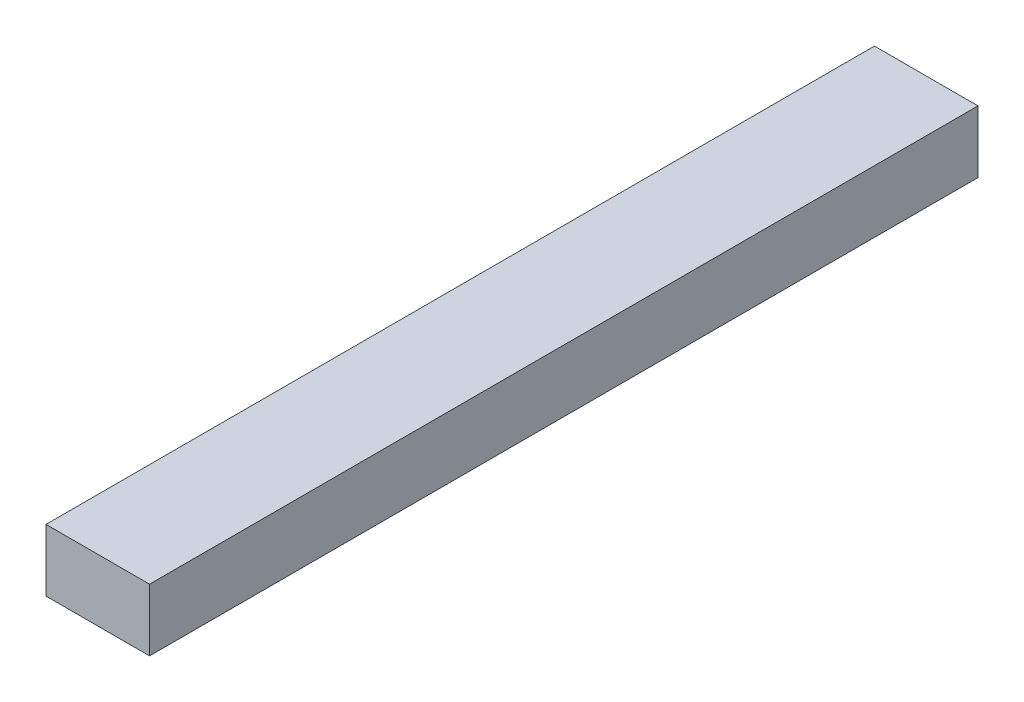
ISO-10303-21;
HEADER;
FILE_DESCRIPTION(('STEP AP214'),'2;1');
FILE_NAME('part.step','',(''),(''),'','','');
FILE_SCHEMA(('AUTOMOTIVE_DESIGN { 1 0 10303 214 1 1 1 1 }'));
ENDSEC;
DATA;
#1=APPLICATION_CONTEXT('core data for automotive mechanical design processes');
#2=APPLICATION_PROTOCOL_DEFINITION('international standard','automotive_design',2000,#1);
#3=PRODUCT_CONTEXT('',#1,'mechanical');
#4=PRODUCT('Part','Part','',(#3));
#5=PRODUCT_RELATED_PRODUCT_CATEGORY('part','',(#4));
#6=PRODUCT_DEFINITION_FORMATION('','',#4);
#7=PRODUCT_DEFINITION_CONTEXT('part definition',#1,'design');
#8=PRODUCT_DEFINITION('design','',#6,#7);
#9=PRODUCT_DEFINITION_SHAPE('','',#8);
#10=(LENGTH_UNIT() NAMED_UNIT(*) SI_UNIT(.MILLI.,.METRE.));
#11=(NAMED_UNIT(*) PLANE_ANGLE_UNIT() SI_UNIT($,.RADIAN.));
#12=(NAMED_UNIT(*) SI_UNIT($,.STERADIAN.) SOLID_ANGLE_UNIT());
#13=UNCERTAINTY_MEASURE_WITH_UNIT(LENGTH_MEASURE(1.E-05),#10,'distance_accuracy_value','');
#14=(GEOMETRIC_REPRESENTATION_CONTEXT(3) GLOBAL_UNCERTAINTY_ASSIGNED_CONTEXT((#13)) GLOBAL_UNIT_ASSIGNED_CONTEXT((#10,
#11,#12)) REPRESENTATION_CONTEXT('',''));
#15=CARTESIAN_POINT('',(0.,0.,0.));
#16=DIRECTION('',(0.,0.,1.));
#17=DIRECTION('',(1.,0.,0.));
#18=AXIS2_PLACEMENT_3D('',#15,#16,#17);
#19=CARTESIAN_POINT('',(-50.,30.,400.));
#20=DIRECTION('',(1.,0.,0.));
#21=DIRECTION('',(0.,1.,0.));
#22=AXIS2_PLACEMENT_3D('',#19,#20,#21);
#23=PLANE('',#22);
#24=DIRECTION('',(0.,-1.,0.));
#25=VECTOR('',#24,1.);
#26=CARTESIAN_POINT('',(-50.,30.,-400.));
#27=LINE('',#26,#25);
#28=CARTESIAN_POINT('',(-50.,30.,-400.));
#29=VERTEX_POINT('',#28);
#30=CARTESIAN_POINT('',(-50.,-30.,-400.));
#31=VERTEX_POINT('',#30);
#32=EDGE_CURVE('E98',#29,#31,#27,.T.);
#33=ORIENTED_EDGE('',*,*,#32,.T.);
#34=DIRECTION('',(0.,0.,-1.));
#35=VECTOR('',#34,1.);
#36=CARTESIAN_POINT('',(-50.,-30.,400.));
#37=LINE('',#36,#35);
#38=CARTESIAN_POINT('',(-50.,-30.,400.));
#39=VERTEX_POINT('',#38);
#40=EDGE_CURVE('E11',#39,#31,#37,.T.);
#41=ORIENTED_EDGE('',*,*,#40,.F.);
#42=DIRECTION('',(0.,-1.,0.));
#43=VECTOR('',#42,1.);
#44=CARTESIAN_POINT('',(-50.,30.,400.));
#45=LINE('',#44,#43);
#46=CARTESIAN_POINT('',(-50.,30.,400.));
#47=VERTEX_POINT('',#46);
#48=EDGE_CURVE('E86',#47,#39,#45,.T.);
#49=ORIENTED_EDGE('',*,*,#48,.F.);
#50=DIRECTION('',(0.,0.,-1.));
#51=VECTOR('',#50,1.);
#52=CARTESIAN_POINT('',(-50.,30.,400.));
#53=LINE('',#52,#51);
#54=EDGE_CURVE('E94',#47,#29,#53,.T.);
#55=ORIENTED_EDGE('',*,*,#54,.T.);
#56=EDGE_LOOP('',(#33,#41,#49,#55));
#57=FACE_BOUND('',#56,.T.);
#58=ADVANCED_FACE('F35',(#57),#23,.F.);
#59=CARTESIAN_POINT('',(50.,-30.,400.));
#60=DIRECTION('',(0.,1.,0.));
#61=DIRECTION('',(-1.,0.,0.));
#62=AXIS2_PLACEMENT_3D('',#59,#60,#61);
#63=PLANE('',#62);
#64=DIRECTION('',(1.,0.,0.));
#65=VECTOR('',#64,1.);
#66=CARTESIAN_POINT('',(50.,-30.,-400.));
#67=LINE('',#66,#65);
#68=CARTESIAN_POINT('',(50.,-30.,-400.));
#69=VERTEX_POINT('',#68);
#70=EDGE_CURVE('E90',#31,#69,#67,.T.);
#71=ORIENTED_EDGE('',*,*,#70,.T.);
#72=DIRECTION('',(0.,0.,-1.));
#73=VECTOR('',#72,1.);
#74=CARTESIAN_POINT('',(50.,-30.,400.));
#75=LINE('',#74,#73);
#76=CARTESIAN_POINT('',(50.,-30.,400.));
#77=VERTEX_POINT('',#76);
#78=EDGE_CURVE('E43',#77,#69,#75,.T.);
#79=ORIENTED_EDGE('',*,*,#78,.F.);
#80=DIRECTION('',(1.,0.,0.));
#81=VECTOR('',#80,1.);
#82=CARTESIAN_POINT('',(50.,-30.,400.));
#83=LINE('',#82,#81);
#84=EDGE_CURVE('E81',#39,#77,#83,.T.);
#85=ORIENTED_EDGE('',*,*,#84,.F.);
#86=ORIENTED_EDGE('',*,*,#40,.T.);
#87=EDGE_LOOP('',(#71,#79,#85,#86));
#88=FACE_BOUND('',#87,.T.);
#89=ADVANCED_FACE('F89',(#88),#63,.F.);
#90=CARTESIAN_POINT('',(50.,30.,400.));
#91=DIRECTION('',(-1.,0.,0.));
#92=DIRECTION('',(0.,-1.,0.));
#93=AXIS2_PLACEMENT_3D('',#90,#91,#92);
#94=PLANE('',#93);
#95=DIRECTION('',(0.,1.,0.));
#96=VECTOR('',#95,1.);
#97=CARTESIAN_POINT('',(50.,30.,-400.));
#98=LINE('',#97,#96);
#99=CARTESIAN_POINT('',(50.,30.,-400.));
#100=VERTEX_POINT('',#99);
#101=EDGE_CURVE('E68',#69,#100,#98,.T.);
#102=ORIENTED_EDGE('',*,*,#101,.T.);
#103=DIRECTION('',(0.,0.,-1.));
#104=VECTOR('',#103,1.);
#105=CARTESIAN_POINT('',(50.,30.,400.));
#106=LINE('',#105,#104);
#107=CARTESIAN_POINT('',(50.,30.,400.));
#108=VERTEX_POINT('',#107);
#109=EDGE_CURVE('E91',#108,#100,#106,.T.);
#110=ORIENTED_EDGE('',*,*,#109,.F.);
#111=DIRECTION('',(0.,1.,0.));
#112=VECTOR('',#111,1.);
#113=CARTESIAN_POINT('',(50.,30.,400.));
#114=LINE('',#113,#112);
#115=EDGE_CURVE('E84',#77,#108,#114,.T.);
#116=ORIENTED_EDGE('',*,*,#115,.F.);
#117=ORIENTED_EDGE('',*,*,#78,.T.);
#118=EDGE_LOOP('',(#102,#110,#116,#117));
#119=FACE_BOUND('',#118,.T.);
#120=ADVANCED_FACE('F92',(#119),#94,.F.);
#121=CARTESIAN_POINT('',(50.,30.,400.));
#122=DIRECTION('',(0.,-1.,0.));
#123=DIRECTION('',(1.,0.,0.));
#124=AXIS2_PLACEMENT_3D('',#121,#122,#123);
#125=PLANE('',#124);
#126=DIRECTION('',(-1.,0.,0.));
#127=VECTOR('',#126,1.);
#128=CARTESIAN_POINT('',(50.,30.,-400.));
#129=LINE('',#128,#127);
#130=EDGE_CURVE('E74',#100,#29,#129,.T.);
#131=ORIENTED_EDGE('',*,*,#130,.T.);
#132=ORIENTED_EDGE('',*,*,#54,.F.);
#133=DIRECTION('',(-1.,0.,0.));
#134=VECTOR('',#133,1.);
#135=CARTESIAN_POINT('',(50.,30.,400.));
#136=LINE('',#135,#134);
#137=EDGE_CURVE('E51',#108,#47,#136,.T.);
#138=ORIENTED_EDGE('',*,*,#137,.F.);
#139=ORIENTED_EDGE('',*,*,#109,.T.);
#140=EDGE_LOOP('',(#131,#132,#138,#139));
#141=FACE_BOUND('',#140,.T.);
#142=ADVANCED_FACE('F105',(#141),#125,.F.);
#143=CARTESIAN_POINT('',(0.,0.,400.));
#144=DIRECTION('',(0.,0.,-1.));
#145=DIRECTION('',(-1.,0.,0.));
#146=AXIS2_PLACEMENT_3D('',#143,#144,#145);
#147=PLANE('',#146);
#148=ORIENTED_EDGE('',*,*,#48,.T.);
#149=ORIENTED_EDGE('',*,*,#84,.T.);
#150=ORIENTED_EDGE('',*,*,#115,.T.);
#151=ORIENTED_EDGE('',*,*,#137,.T.);
#152=EDGE_LOOP('',(#148,#149,#150,#151));
#153=FACE_BOUND('',#152,.T.);
#154=ADVANCED_FACE('F82',(#153),#147,.F.);
#155=CARTESIAN_POINT('',(0.,0.,-400.));
#156=DIRECTION('',(0.,0.,-1.));
#157=DIRECTION('',(-1.,0.,0.));
#158=AXIS2_PLACEMENT_3D('',#155,#156,#157);
#159=PLANE('',#158);
#160=ORIENTED_EDGE('',*,*,#32,.F.);
#161=ORIENTED_EDGE('',*,*,#130,.F.);
#162=ORIENTED_EDGE('',*,*,#101,.F.);
#163=ORIENTED_EDGE('',*,*,#70,.F.);
#164=EDGE_LOOP('',(#160,#161,#162,#163));
#165=FACE_BOUND('',#164,.T.);
#166=ADVANCED_FACE('F108',(#165),#159,.T.);
#167=CLOSED_SHELL('',(#58,#89,#120,#142,#154,#166));
#168=MANIFOLD_SOLID_BREP('B2',#167);
#169=ADVANCED_BREP_SHAPE_REPRESENTATION('',(#18,#168),#14);
#170=SHAPE_DEFINITION_REPRESENTATION(#9,#169);
ENDSEC;
END-ISO-10303-21;
